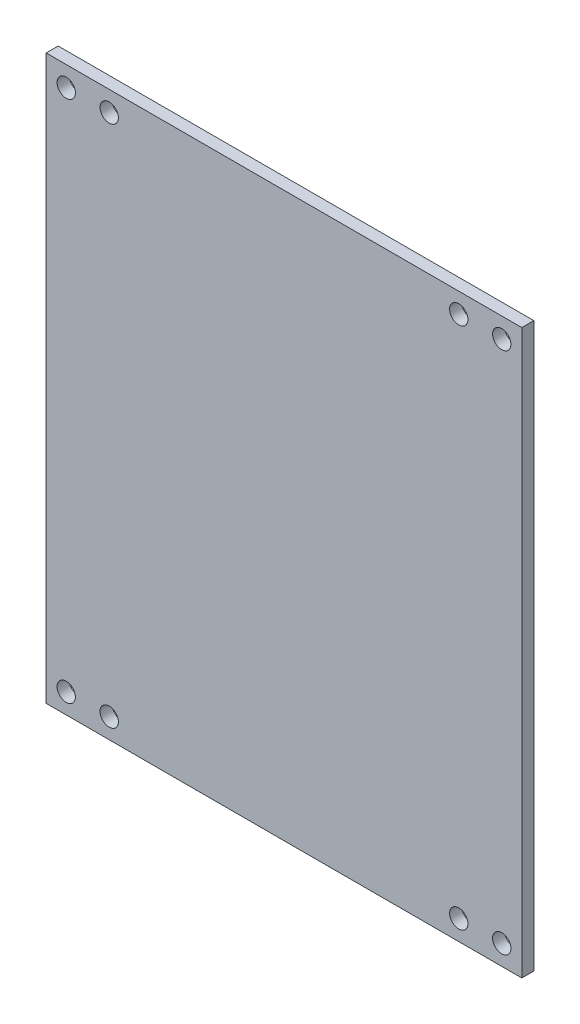
ISO-10303-21;
HEADER;
FILE_DESCRIPTION(('STEP AP214'),'2;1');
FILE_NAME('part.step','',(''),(''),'','','');
FILE_SCHEMA(('AUTOMOTIVE_DESIGN { 1 0 10303 214 1 1 1 1 }'));
ENDSEC;
DATA;
#1=APPLICATION_CONTEXT('core data for automotive mechanical design processes');
#2=APPLICATION_PROTOCOL_DEFINITION('international standard','automotive_design',2000,#1);
#3=PRODUCT_CONTEXT('',#1,'mechanical');
#4=PRODUCT('Part','Part','',(#3));
#5=PRODUCT_RELATED_PRODUCT_CATEGORY('part','',(#4));
#6=PRODUCT_DEFINITION_FORMATION('','',#4);
#7=PRODUCT_DEFINITION_CONTEXT('part definition',#1,'design');
#8=PRODUCT_DEFINITION('design','',#6,#7);
#9=PRODUCT_DEFINITION_SHAPE('','',#8);
#10=(LENGTH_UNIT() NAMED_UNIT(*) SI_UNIT(.MILLI.,.METRE.));
#11=(NAMED_UNIT(*) PLANE_ANGLE_UNIT() SI_UNIT($,.RADIAN.));
#12=(NAMED_UNIT(*) SI_UNIT($,.STERADIAN.) SOLID_ANGLE_UNIT());
#13=UNCERTAINTY_MEASURE_WITH_UNIT(LENGTH_MEASURE(1.E-05),#10,'distance_accuracy_value','');
#14=(GEOMETRIC_REPRESENTATION_CONTEXT(3) GLOBAL_UNCERTAINTY_ASSIGNED_CONTEXT((#13)) GLOBAL_UNIT_ASSIGNED_CONTEXT((#10,
#11,#12)) REPRESENTATION_CONTEXT('',''));
#15=CARTESIAN_POINT('',(0.,0.,0.));
#16=DIRECTION('',(0.,0.,1.));
#17=DIRECTION('',(1.,0.,0.));
#18=AXIS2_PLACEMENT_3D('',#15,#16,#17);
#19=CARTESIAN_POINT('',(51.2048730601777,39.0497204993356,0.));
#20=DIRECTION('',(0.,0.,1.));
#21=DIRECTION('',(1.,0.,0.));
#22=AXIS2_PLACEMENT_3D('',#19,#20,#21);
#23=PLANE('',#22);
#24=CARTESIAN_POINT('',(89.2048730601777,84.6997204993356,0.));
#25=DIRECTION('',(0.,0.,1.));
#26=DIRECTION('',(1.,0.,0.));
#27=AXIS2_PLACEMENT_3D('',#24,#25,#26);
#28=CIRCLE('',#27,1.6);
#29=CARTESIAN_POINT('',(90.8048730601777,84.6997204993356,0.));
#30=VERTEX_POINT('',#29);
#31=EDGE_CURVE('E100',#30,#30,#28,.T.);
#32=ORIENTED_EDGE('',*,*,#31,.T.);
#33=EDGE_LOOP('',(#32));
#34=FACE_BOUND('',#33,.T.);
#35=CARTESIAN_POINT('',(20.7048730601777,-6.6002795006644,0.));
#36=DIRECTION('',(0.,0.,1.));
#37=DIRECTION('',(1.,0.,0.));
#38=AXIS2_PLACEMENT_3D('',#35,#36,#37);
#39=CIRCLE('',#38,1.6);
#40=CARTESIAN_POINT('',(22.3048730601777,-6.6002795006644,0.));
#41=VERTEX_POINT('',#40);
#42=EDGE_CURVE('E104',#41,#41,#39,.T.);
#43=ORIENTED_EDGE('',*,*,#42,.T.);
#44=EDGE_LOOP('',(#43));
#45=FACE_BOUND('',#44,.T.);
#46=CARTESIAN_POINT('',(13.2048730601777,-6.6002795006644,0.));
#47=DIRECTION('',(0.,0.,1.));
#48=DIRECTION('',(1.,0.,0.));
#49=AXIS2_PLACEMENT_3D('',#46,#47,#48);
#50=CIRCLE('',#49,1.6);
#51=CARTESIAN_POINT('',(14.8048730601777,-6.6002795006644,0.));
#52=VERTEX_POINT('',#51);
#53=EDGE_CURVE('E107',#52,#52,#50,.T.);
#54=ORIENTED_EDGE('',*,*,#53,.T.);
#55=EDGE_LOOP('',(#54));
#56=FACE_BOUND('',#55,.T.);
#57=CARTESIAN_POINT('',(89.2048730601777,-6.6002795006644,0.));
#58=DIRECTION('',(0.,0.,1.));
#59=DIRECTION('',(1.,0.,0.));
#60=AXIS2_PLACEMENT_3D('',#57,#58,#59);
#61=CIRCLE('',#60,1.6);
#62=CARTESIAN_POINT('',(90.8048730601777,-6.6002795006644,0.));
#63=VERTEX_POINT('',#62);
#64=EDGE_CURVE('E110',#63,#63,#61,.T.);
#65=ORIENTED_EDGE('',*,*,#64,.T.);
#66=EDGE_LOOP('',(#65));
#67=FACE_BOUND('',#66,.T.);
#68=CARTESIAN_POINT('',(81.7048730601777,84.6997204993356,0.));
#69=DIRECTION('',(0.,0.,1.));
#70=DIRECTION('',(1.,0.,0.));
#71=AXIS2_PLACEMENT_3D('',#68,#69,#70);
#72=CIRCLE('',#71,1.6);
#73=CARTESIAN_POINT('',(83.3048730601778,84.6997204993356,0.));
#74=VERTEX_POINT('',#73);
#75=EDGE_CURVE('E113',#74,#74,#72,.T.);
#76=ORIENTED_EDGE('',*,*,#75,.T.);
#77=EDGE_LOOP('',(#76));
#78=FACE_BOUND('',#77,.T.);
#79=CARTESIAN_POINT('',(81.7048730601777,-6.6002795006644,0.));
#80=DIRECTION('',(0.,0.,1.));
#81=DIRECTION('',(1.,0.,0.));
#82=AXIS2_PLACEMENT_3D('',#79,#80,#81);
#83=CIRCLE('',#82,1.6);
#84=CARTESIAN_POINT('',(83.3048730601778,-6.6002795006644,0.));
#85=VERTEX_POINT('',#84);
#86=EDGE_CURVE('E116',#85,#85,#83,.T.);
#87=ORIENTED_EDGE('',*,*,#86,.T.);
#88=EDGE_LOOP('',(#87));
#89=FACE_BOUND('',#88,.T.);
#90=CARTESIAN_POINT('',(20.7048730601777,84.6997204993356,0.));
#91=DIRECTION('',(0.,0.,1.));
#92=DIRECTION('',(1.,0.,0.));
#93=AXIS2_PLACEMENT_3D('',#90,#91,#92);
#94=CIRCLE('',#93,1.6);
#95=CARTESIAN_POINT('',(22.3048730601777,84.6997204993356,0.));
#96=VERTEX_POINT('',#95);
#97=EDGE_CURVE('E118',#96,#96,#94,.T.);
#98=ORIENTED_EDGE('',*,*,#97,.T.);
#99=EDGE_LOOP('',(#98));
#100=FACE_BOUND('',#99,.T.);
#101=CARTESIAN_POINT('',(13.2048730601777,84.6997204993356,0.));
#102=DIRECTION('',(0.,0.,1.));
#103=DIRECTION('',(1.,0.,0.));
#104=AXIS2_PLACEMENT_3D('',#101,#102,#103);
#105=CIRCLE('',#104,1.6);
#106=CARTESIAN_POINT('',(14.8048730601777,84.6997204993356,0.));
#107=VERTEX_POINT('',#106);
#108=EDGE_CURVE('E18',#107,#107,#105,.T.);
#109=ORIENTED_EDGE('',*,*,#108,.T.);
#110=EDGE_LOOP('',(#109));
#111=FACE_BOUND('',#110,.T.);
#112=DIRECTION('',(0.,1.,0.));
#113=VECTOR('',#112,1.);
#114=CARTESIAN_POINT('',(92.7048730601777,84.6997204993356,0.));
#115=LINE('',#114,#113);
#116=CARTESIAN_POINT('',(92.7048730601777,-10.1002795006644,0.));
#117=VERTEX_POINT('',#116);
#118=CARTESIAN_POINT('',(92.7048730601777,88.1997204993356,0.));
#119=VERTEX_POINT('',#118);
#120=EDGE_CURVE('E125',#117,#119,#115,.T.);
#121=ORIENTED_EDGE('',*,*,#120,.F.);
#122=DIRECTION('',(1.,0.,0.));
#123=VECTOR('',#122,1.);
#124=CARTESIAN_POINT('',(20.7048730601777,-10.1002795006644,0.));
#125=LINE('',#124,#123);
#126=CARTESIAN_POINT('',(9.70487306017772,-10.1002795006644,0.));
#127=VERTEX_POINT('',#126);
#128=EDGE_CURVE('E68',#127,#117,#125,.T.);
#129=ORIENTED_EDGE('',*,*,#128,.F.);
#130=DIRECTION('',(0.,1.,0.));
#131=VECTOR('',#130,1.);
#132=CARTESIAN_POINT('',(9.70487306017772,84.6997204993356,0.));
#133=LINE('',#132,#131);
#134=CARTESIAN_POINT('',(9.70487306017772,88.1997204993356,0.));
#135=VERTEX_POINT('',#134);
#136=EDGE_CURVE('E53',#135,#127,#133,.F.);
#137=ORIENTED_EDGE('',*,*,#136,.F.);
#138=DIRECTION('',(1.,0.,0.));
#139=VECTOR('',#138,1.);
#140=CARTESIAN_POINT('',(20.7048730601777,88.1997204993356,0.));
#141=LINE('',#140,#139);
#142=EDGE_CURVE('E58',#119,#135,#141,.F.);
#143=ORIENTED_EDGE('',*,*,#142,.F.);
#144=EDGE_LOOP('',(#121,#129,#137,#143));
#145=FACE_BOUND('',#144,.T.);
#146=ADVANCED_FACE('F15',(#34,#45,#56,#67,#78,#89,#100,#111,#145),#23,.F.);
#147=CARTESIAN_POINT('',(20.7048730601777,88.1997204993356,0.));
#148=DIRECTION('',(0.,1.,0.));
#149=DIRECTION('',(0.,0.,1.));
#150=AXIS2_PLACEMENT_3D('',#147,#148,#149);
#151=PLANE('',#150);
#152=ORIENTED_EDGE('',*,*,#142,.T.);
#153=DIRECTION('',(0.,0.,1.));
#154=VECTOR('',#153,1.);
#155=CARTESIAN_POINT('',(9.70487306017772,88.1997204993356,0.));
#156=LINE('',#155,#154);
#157=CARTESIAN_POINT('',(9.70487306017772,88.1997204993356,2.1));
#158=VERTEX_POINT('',#157);
#159=EDGE_CURVE('E60',#158,#135,#156,.F.);
#160=ORIENTED_EDGE('',*,*,#159,.F.);
#161=DIRECTION('',(1.,0.,0.));
#162=VECTOR('',#161,1.);
#163=CARTESIAN_POINT('',(51.2048730601777,88.1997204993356,2.1));
#164=LINE('',#163,#162);
#165=CARTESIAN_POINT('',(92.7048730601777,88.1997204993356,2.1));
#166=VERTEX_POINT('',#165);
#167=EDGE_CURVE('E103',#166,#158,#164,.F.);
#168=ORIENTED_EDGE('',*,*,#167,.F.);
#169=DIRECTION('',(0.,0.,-1.));
#170=VECTOR('',#169,1.);
#171=CARTESIAN_POINT('',(92.7048730601777,88.1997204993356,0.));
#172=LINE('',#171,#170);
#173=EDGE_CURVE('E63',#119,#166,#172,.F.);
#174=ORIENTED_EDGE('',*,*,#173,.F.);
#175=EDGE_LOOP('',(#152,#160,#168,#174));
#176=FACE_BOUND('',#175,.T.);
#177=ADVANCED_FACE('F59',(#176),#151,.T.);
#178=CARTESIAN_POINT('',(9.70487306017772,84.6997204993356,0.));
#179=DIRECTION('',(-1.,0.,0.));
#180=DIRECTION('',(0.,0.,1.));
#181=AXIS2_PLACEMENT_3D('',#178,#179,#180);
#182=PLANE('',#181);
#183=ORIENTED_EDGE('',*,*,#136,.T.);
#184=DIRECTION('',(0.,0.,-1.));
#185=VECTOR('',#184,1.);
#186=CARTESIAN_POINT('',(9.70487306017772,-10.1002795006644,0.));
#187=LINE('',#186,#185);
#188=CARTESIAN_POINT('',(9.70487306017772,-10.1002795006644,2.1));
#189=VERTEX_POINT('',#188);
#190=EDGE_CURVE('E70',#189,#127,#187,.T.);
#191=ORIENTED_EDGE('',*,*,#190,.F.);
#192=DIRECTION('',(0.,1.,0.));
#193=VECTOR('',#192,1.);
#194=CARTESIAN_POINT('',(9.70487306017772,39.0497204993356,2.1));
#195=LINE('',#194,#193);
#196=EDGE_CURVE('E74',#158,#189,#195,.F.);
#197=ORIENTED_EDGE('',*,*,#196,.F.);
#198=ORIENTED_EDGE('',*,*,#159,.T.);
#199=EDGE_LOOP('',(#183,#191,#197,#198));
#200=FACE_BOUND('',#199,.T.);
#201=ADVANCED_FACE('F72',(#200),#182,.T.);
#202=CARTESIAN_POINT('',(20.7048730601777,-10.1002795006644,0.));
#203=DIRECTION('',(0.,-1.,0.));
#204=DIRECTION('',(0.,0.,-1.));
#205=AXIS2_PLACEMENT_3D('',#202,#203,#204);
#206=PLANE('',#205);
#207=ORIENTED_EDGE('',*,*,#128,.T.);
#208=DIRECTION('',(0.,0.,-1.));
#209=VECTOR('',#208,1.);
#210=CARTESIAN_POINT('',(92.7048730601777,-10.1002795006644,0.));
#211=LINE('',#210,#209);
#212=CARTESIAN_POINT('',(92.7048730601777,-10.1002795006644,2.1));
#213=VERTEX_POINT('',#212);
#214=EDGE_CURVE('E33',#213,#117,#211,.T.);
#215=ORIENTED_EDGE('',*,*,#214,.F.);
#216=DIRECTION('',(1.,0.,0.));
#217=VECTOR('',#216,1.);
#218=CARTESIAN_POINT('',(51.2048730601777,-10.1002795006644,2.1));
#219=LINE('',#218,#217);
#220=EDGE_CURVE('E136',#189,#213,#219,.T.);
#221=ORIENTED_EDGE('',*,*,#220,.F.);
#222=ORIENTED_EDGE('',*,*,#190,.T.);
#223=EDGE_LOOP('',(#207,#215,#221,#222));
#224=FACE_BOUND('',#223,.T.);
#225=ADVANCED_FACE('F134',(#224),#206,.T.);
#226=CARTESIAN_POINT('',(92.7048730601777,84.6997204993356,0.));
#227=DIRECTION('',(1.,0.,0.));
#228=DIRECTION('',(0.,0.,-1.));
#229=AXIS2_PLACEMENT_3D('',#226,#227,#228);
#230=PLANE('',#229);
#231=ORIENTED_EDGE('',*,*,#120,.T.);
#232=ORIENTED_EDGE('',*,*,#173,.T.);
#233=DIRECTION('',(0.,1.,0.));
#234=VECTOR('',#233,1.);
#235=CARTESIAN_POINT('',(92.7048730601777,39.0497204993356,2.1));
#236=LINE('',#235,#234);
#237=EDGE_CURVE('E99',#213,#166,#236,.T.);
#238=ORIENTED_EDGE('',*,*,#237,.F.);
#239=ORIENTED_EDGE('',*,*,#214,.T.);
#240=EDGE_LOOP('',(#231,#232,#238,#239));
#241=FACE_BOUND('',#240,.T.);
#242=ADVANCED_FACE('F141',(#241),#230,.T.);
#243=CARTESIAN_POINT('',(13.2048730601777,84.6997204993356,-1.9));
#244=DIRECTION('',(0.,0.,1.));
#245=DIRECTION('',(1.,0.,0.));
#246=AXIS2_PLACEMENT_3D('',#243,#244,#245);
#247=CYLINDRICAL_SURFACE('',#246,1.6);
#248=CARTESIAN_POINT('',(13.2048730601777,84.6997204993356,2.1));
#249=DIRECTION('',(0.,0.,1.));
#250=DIRECTION('',(1.,0.,0.));
#251=AXIS2_PLACEMENT_3D('',#248,#249,#250);
#252=CIRCLE('',#251,1.6);
#253=CARTESIAN_POINT('',(14.8048730601777,84.6997204993356,2.1));
#254=VERTEX_POINT('',#253);
#255=EDGE_CURVE('E96',#254,#254,#252,.F.);
#256=ORIENTED_EDGE('',*,*,#255,.F.);
#257=EDGE_LOOP('',(#256));
#258=FACE_BOUND('',#257,.T.);
#259=ORIENTED_EDGE('',*,*,#108,.F.);
#260=EDGE_LOOP('',(#259));
#261=FACE_BOUND('',#260,.T.);
#262=ADVANCED_FACE('F143',(#258,#261),#247,.F.);
#263=CARTESIAN_POINT('',(20.7048730601777,84.6997204993356,-1.9));
#264=DIRECTION('',(0.,0.,1.));
#265=DIRECTION('',(1.,0.,0.));
#266=AXIS2_PLACEMENT_3D('',#263,#264,#265);
#267=CYLINDRICAL_SURFACE('',#266,1.6);
#268=CARTESIAN_POINT('',(20.7048730601777,84.6997204993356,2.1));
#269=DIRECTION('',(0.,0.,1.));
#270=DIRECTION('',(1.,0.,0.));
#271=AXIS2_PLACEMENT_3D('',#268,#269,#270);
#272=CIRCLE('',#271,1.6);
#273=CARTESIAN_POINT('',(22.3048730601777,84.6997204993356,2.1));
#274=VERTEX_POINT('',#273);
#275=EDGE_CURVE('E93',#274,#274,#272,.F.);
#276=ORIENTED_EDGE('',*,*,#275,.F.);
#277=EDGE_LOOP('',(#276));
#278=FACE_BOUND('',#277,.T.);
#279=ORIENTED_EDGE('',*,*,#97,.F.);
#280=EDGE_LOOP('',(#279));
#281=FACE_BOUND('',#280,.T.);
#282=ADVANCED_FACE('F150',(#278,#281),#267,.F.);
#283=CARTESIAN_POINT('',(81.7048730601777,-6.6002795006644,-1.9));
#284=DIRECTION('',(0.,0.,1.));
#285=DIRECTION('',(1.,0.,0.));
#286=AXIS2_PLACEMENT_3D('',#283,#284,#285);
#287=CYLINDRICAL_SURFACE('',#286,1.6);
#288=CARTESIAN_POINT('',(81.7048730601777,-6.6002795006644,2.1));
#289=DIRECTION('',(0.,0.,1.));
#290=DIRECTION('',(1.,0.,0.));
#291=AXIS2_PLACEMENT_3D('',#288,#289,#290);
#292=CIRCLE('',#291,1.6);
#293=CARTESIAN_POINT('',(83.3048730601778,-6.6002795006644,2.1));
#294=VERTEX_POINT('',#293);
#295=EDGE_CURVE('E90',#294,#294,#292,.F.);
#296=ORIENTED_EDGE('',*,*,#295,.F.);
#297=EDGE_LOOP('',(#296));
#298=FACE_BOUND('',#297,.T.);
#299=ORIENTED_EDGE('',*,*,#86,.F.);
#300=EDGE_LOOP('',(#299));
#301=FACE_BOUND('',#300,.T.);
#302=ADVANCED_FACE('F182',(#298,#301),#287,.F.);
#303=CARTESIAN_POINT('',(81.7048730601777,84.6997204993356,-1.9));
#304=DIRECTION('',(0.,0.,1.));
#305=DIRECTION('',(1.,0.,0.));
#306=AXIS2_PLACEMENT_3D('',#303,#304,#305);
#307=CYLINDRICAL_SURFACE('',#306,1.6);
#308=CARTESIAN_POINT('',(81.7048730601777,84.6997204993356,2.1));
#309=DIRECTION('',(0.,0.,1.));
#310=DIRECTION('',(1.,0.,0.));
#311=AXIS2_PLACEMENT_3D('',#308,#309,#310);
#312=CIRCLE('',#311,1.6);
#313=CARTESIAN_POINT('',(83.3048730601778,84.6997204993356,2.1));
#314=VERTEX_POINT('',#313);
#315=EDGE_CURVE('E87',#314,#314,#312,.F.);
#316=ORIENTED_EDGE('',*,*,#315,.F.);
#317=EDGE_LOOP('',(#316));
#318=FACE_BOUND('',#317,.T.);
#319=ORIENTED_EDGE('',*,*,#75,.F.);
#320=EDGE_LOOP('',(#319));
#321=FACE_BOUND('',#320,.T.);
#322=ADVANCED_FACE('F178',(#318,#321),#307,.F.);
#323=CARTESIAN_POINT('',(89.2048730601777,-6.6002795006644,-1.9));
#324=DIRECTION('',(0.,0.,1.));
#325=DIRECTION('',(1.,0.,0.));
#326=AXIS2_PLACEMENT_3D('',#323,#324,#325);
#327=CYLINDRICAL_SURFACE('',#326,1.6);
#328=CARTESIAN_POINT('',(89.2048730601777,-6.6002795006644,2.1));
#329=DIRECTION('',(0.,0.,1.));
#330=DIRECTION('',(1.,0.,0.));
#331=AXIS2_PLACEMENT_3D('',#328,#329,#330);
#332=CIRCLE('',#331,1.6);
#333=CARTESIAN_POINT('',(90.8048730601777,-6.6002795006644,2.1));
#334=VERTEX_POINT('',#333);
#335=EDGE_CURVE('E84',#334,#334,#332,.F.);
#336=ORIENTED_EDGE('',*,*,#335,.F.);
#337=EDGE_LOOP('',(#336));
#338=FACE_BOUND('',#337,.T.);
#339=ORIENTED_EDGE('',*,*,#64,.F.);
#340=EDGE_LOOP('',(#339));
#341=FACE_BOUND('',#340,.T.);
#342=ADVANCED_FACE('F174',(#338,#341),#327,.F.);
#343=CARTESIAN_POINT('',(13.2048730601777,-6.6002795006644,-1.9));
#344=DIRECTION('',(0.,0.,1.));
#345=DIRECTION('',(1.,0.,0.));
#346=AXIS2_PLACEMENT_3D('',#343,#344,#345);
#347=CYLINDRICAL_SURFACE('',#346,1.6);
#348=CARTESIAN_POINT('',(13.2048730601777,-6.6002795006644,2.1));
#349=DIRECTION('',(0.,0.,1.));
#350=DIRECTION('',(1.,0.,0.));
#351=AXIS2_PLACEMENT_3D('',#348,#349,#350);
#352=CIRCLE('',#351,1.6);
#353=CARTESIAN_POINT('',(14.8048730601777,-6.6002795006644,2.1));
#354=VERTEX_POINT('',#353);
#355=EDGE_CURVE('E81',#354,#354,#352,.F.);
#356=ORIENTED_EDGE('',*,*,#355,.F.);
#357=EDGE_LOOP('',(#356));
#358=FACE_BOUND('',#357,.T.);
#359=ORIENTED_EDGE('',*,*,#53,.F.);
#360=EDGE_LOOP('',(#359));
#361=FACE_BOUND('',#360,.T.);
#362=ADVANCED_FACE('F170',(#358,#361),#347,.F.);
#363=CARTESIAN_POINT('',(20.7048730601777,-6.6002795006644,-1.9));
#364=DIRECTION('',(0.,0.,1.));
#365=DIRECTION('',(1.,0.,0.));
#366=AXIS2_PLACEMENT_3D('',#363,#364,#365);
#367=CYLINDRICAL_SURFACE('',#366,1.6);
#368=CARTESIAN_POINT('',(20.7048730601777,-6.6002795006644,2.1));
#369=DIRECTION('',(0.,0.,1.));
#370=DIRECTION('',(1.,0.,0.));
#371=AXIS2_PLACEMENT_3D('',#368,#369,#370);
#372=CIRCLE('',#371,1.6);
#373=CARTESIAN_POINT('',(22.3048730601777,-6.6002795006644,2.1));
#374=VERTEX_POINT('',#373);
#375=EDGE_CURVE('E24',#374,#374,#372,.F.);
#376=ORIENTED_EDGE('',*,*,#375,.F.);
#377=EDGE_LOOP('',(#376));
#378=FACE_BOUND('',#377,.T.);
#379=ORIENTED_EDGE('',*,*,#42,.F.);
#380=EDGE_LOOP('',(#379));
#381=FACE_BOUND('',#380,.T.);
#382=ADVANCED_FACE('F163',(#378,#381),#367,.F.);
#383=CARTESIAN_POINT('',(89.2048730601777,84.6997204993356,-1.9));
#384=DIRECTION('',(0.,0.,1.));
#385=DIRECTION('',(1.,0.,0.));
#386=AXIS2_PLACEMENT_3D('',#383,#384,#385);
#387=CYLINDRICAL_SURFACE('',#386,1.6);
#388=CARTESIAN_POINT('',(89.2048730601777,84.6997204993356,2.1));
#389=DIRECTION('',(0.,0.,1.));
#390=DIRECTION('',(1.,0.,0.));
#391=AXIS2_PLACEMENT_3D('',#388,#389,#390);
#392=CIRCLE('',#391,1.6);
#393=CARTESIAN_POINT('',(90.8048730601777,84.6997204993356,2.1));
#394=VERTEX_POINT('',#393);
#395=EDGE_CURVE('E10',#394,#394,#392,.F.);
#396=ORIENTED_EDGE('',*,*,#395,.F.);
#397=EDGE_LOOP('',(#396));
#398=FACE_BOUND('',#397,.T.);
#399=ORIENTED_EDGE('',*,*,#31,.F.);
#400=EDGE_LOOP('',(#399));
#401=FACE_BOUND('',#400,.T.);
#402=ADVANCED_FACE('F155',(#398,#401),#387,.F.);
#403=CARTESIAN_POINT('',(51.2048730601777,39.0497204993356,2.1));
#404=DIRECTION('',(0.,0.,1.));
#405=DIRECTION('',(1.,0.,0.));
#406=AXIS2_PLACEMENT_3D('',#403,#404,#405);
#407=PLANE('',#406);
#408=ORIENTED_EDGE('',*,*,#395,.T.);
#409=EDGE_LOOP('',(#408));
#410=FACE_BOUND('',#409,.T.);
#411=ORIENTED_EDGE('',*,*,#375,.T.);
#412=EDGE_LOOP('',(#411));
#413=FACE_BOUND('',#412,.T.);
#414=ORIENTED_EDGE('',*,*,#355,.T.);
#415=EDGE_LOOP('',(#414));
#416=FACE_BOUND('',#415,.T.);
#417=ORIENTED_EDGE('',*,*,#335,.T.);
#418=EDGE_LOOP('',(#417));
#419=FACE_BOUND('',#418,.T.);
#420=ORIENTED_EDGE('',*,*,#315,.T.);
#421=EDGE_LOOP('',(#420));
#422=FACE_BOUND('',#421,.T.);
#423=ORIENTED_EDGE('',*,*,#295,.T.);
#424=EDGE_LOOP('',(#423));
#425=FACE_BOUND('',#424,.T.);
#426=ORIENTED_EDGE('',*,*,#275,.T.);
#427=EDGE_LOOP('',(#426));
#428=FACE_BOUND('',#427,.T.);
#429=ORIENTED_EDGE('',*,*,#255,.T.);
#430=EDGE_LOOP('',(#429));
#431=FACE_BOUND('',#430,.T.);
#432=ORIENTED_EDGE('',*,*,#220,.T.);
#433=ORIENTED_EDGE('',*,*,#237,.T.);
#434=ORIENTED_EDGE('',*,*,#167,.T.);
#435=ORIENTED_EDGE('',*,*,#196,.T.);
#436=EDGE_LOOP('',(#432,#433,#434,#435));
#437=FACE_BOUND('',#436,.T.);
#438=ADVANCED_FACE('F139',(#410,#413,#416,#419,#422,#425,#428,#431,#437),#407,.T.);
#439=CLOSED_SHELL('',(#146,#177,#201,#225,#242,#262,#282,#302,#322,#342,#362,#382,#402,#438));
#440=MANIFOLD_SOLID_BREP('B1',#439);
#441=ADVANCED_BREP_SHAPE_REPRESENTATION('',(#18,#440),#14);
#442=SHAPE_DEFINITION_REPRESENTATION(#9,#441);
ENDSEC;
END-ISO-10303-21;
